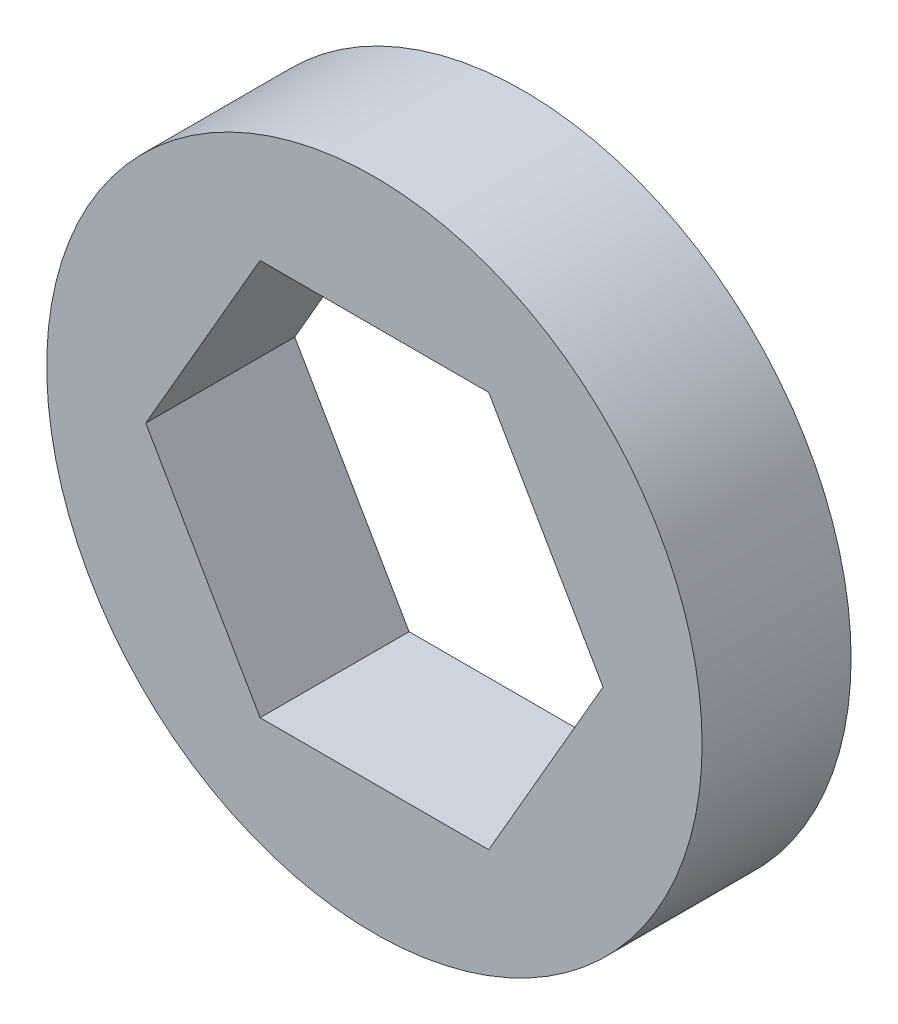
ISO-10303-21;
HEADER;
FILE_DESCRIPTION(('STEP AP214'),'2;1');
FILE_NAME('part.step','',(''),(''),'','','');
FILE_SCHEMA(('AUTOMOTIVE_DESIGN { 1 0 10303 214 1 1 1 1 }'));
ENDSEC;
DATA;
#1=APPLICATION_CONTEXT('core data for automotive mechanical design processes');
#2=APPLICATION_PROTOCOL_DEFINITION('international standard','automotive_design',2000,#1);
#3=PRODUCT_CONTEXT('',#1,'mechanical');
#4=PRODUCT('Part','Part','',(#3));
#5=PRODUCT_RELATED_PRODUCT_CATEGORY('part','',(#4));
#6=PRODUCT_DEFINITION_FORMATION('','',#4);
#7=PRODUCT_DEFINITION_CONTEXT('part definition',#1,'design');
#8=PRODUCT_DEFINITION('design','',#6,#7);
#9=PRODUCT_DEFINITION_SHAPE('','',#8);
#10=(LENGTH_UNIT() NAMED_UNIT(*) SI_UNIT(.MILLI.,.METRE.));
#11=(NAMED_UNIT(*) PLANE_ANGLE_UNIT() SI_UNIT($,.RADIAN.));
#12=(NAMED_UNIT(*) SI_UNIT($,.STERADIAN.) SOLID_ANGLE_UNIT());
#13=UNCERTAINTY_MEASURE_WITH_UNIT(LENGTH_MEASURE(1.E-05),#10,'distance_accuracy_value','');
#14=(GEOMETRIC_REPRESENTATION_CONTEXT(3) GLOBAL_UNCERTAINTY_ASSIGNED_CONTEXT((#13)) GLOBAL_UNIT_ASSIGNED_CONTEXT((#10,
#11,#12)) REPRESENTATION_CONTEXT('',''));
#15=CARTESIAN_POINT('',(0.,0.,0.));
#16=DIRECTION('',(0.,0.,1.));
#17=DIRECTION('',(1.,0.,0.));
#18=AXIS2_PLACEMENT_3D('',#15,#16,#17);
#19=CARTESIAN_POINT('',(0.,0.,4.7752));
#20=DIRECTION('',(0.,0.,1.));
#21=DIRECTION('',(1.,0.,0.));
#22=AXIS2_PLACEMENT_3D('',#19,#20,#21);
#23=PLANE('',#22);
#24=CARTESIAN_POINT('',(0.,0.,4.7752));
#25=DIRECTION('',(0.,0.,1.));
#26=DIRECTION('',(1.,0.,0.));
#27=AXIS2_PLACEMENT_3D('',#24,#25,#26);
#28=CIRCLE('',#27,10.5029);
#29=CARTESIAN_POINT('',(10.5029,0.,4.7752));
#30=VERTEX_POINT('',#29);
#31=EDGE_CURVE('E11',#30,#30,#28,.T.);
#32=ORIENTED_EDGE('',*,*,#31,.T.);
#33=EDGE_LOOP('',(#32));
#34=FACE_BOUND('',#33,.T.);
#35=DIRECTION('',(0.500000000000001,-0.866025403784438,0.));
#36=VECTOR('',#35,1.);
#37=CARTESIAN_POINT('',(-7.3279,0.,4.7752));
#38=LINE('',#37,#36);
#39=CARTESIAN_POINT('',(-7.3279,0.,4.7752));
#40=VERTEX_POINT('',#39);
#41=CARTESIAN_POINT('',(-3.66394999999998,-6.346147556392,4.7752));
#42=VERTEX_POINT('',#41);
#43=EDGE_CURVE('E102',#40,#42,#38,.T.);
#44=ORIENTED_EDGE('',*,*,#43,.F.);
#45=DIRECTION('',(-0.499999999999995,-0.866025403784442,0.));
#46=VECTOR('',#45,1.);
#47=CARTESIAN_POINT('',(-3.66395000000007,6.34614755639194,4.7752));
#48=LINE('',#47,#46);
#49=CARTESIAN_POINT('',(-3.66395000000007,6.34614755639194,4.7752));
#50=VERTEX_POINT('',#49);
#51=EDGE_CURVE('E93',#50,#40,#48,.T.);
#52=ORIENTED_EDGE('',*,*,#51,.F.);
#53=DIRECTION('',(-1.,0.,0.));
#54=VECTOR('',#53,1.);
#55=CARTESIAN_POINT('',(3.66394999999994,6.34614755639202,4.7752));
#56=LINE('',#55,#54);
#57=CARTESIAN_POINT('',(3.66394999999994,6.34614755639202,4.7752));
#58=VERTEX_POINT('',#57);
#59=EDGE_CURVE('E127',#58,#50,#56,.T.);
#60=ORIENTED_EDGE('',*,*,#59,.F.);
#61=DIRECTION('',(-0.500000000000007,0.866025403784435,0.));
#62=VECTOR('',#61,1.);
#63=CARTESIAN_POINT('',(7.3279,0.,4.7752));
#64=LINE('',#63,#62);
#65=CARTESIAN_POINT('',(7.3279,0.,4.7752));
#66=VERTEX_POINT('',#65);
#67=EDGE_CURVE('E124',#66,#58,#64,.T.);
#68=ORIENTED_EDGE('',*,*,#67,.F.);
#69=DIRECTION('',(0.499999999999995,0.866025403784442,0.));
#70=VECTOR('',#69,1.);
#71=CARTESIAN_POINT('',(3.66395000000003,-6.34614755639197,4.7752));
#72=LINE('',#71,#70);
#73=CARTESIAN_POINT('',(3.66395000000003,-6.34614755639197,4.7752));
#74=VERTEX_POINT('',#73);
#75=EDGE_CURVE('E119',#74,#66,#72,.T.);
#76=ORIENTED_EDGE('',*,*,#75,.F.);
#77=DIRECTION('',(1.,0.,0.));
#78=VECTOR('',#77,1.);
#79=CARTESIAN_POINT('',(-3.66394999999998,-6.346147556392,4.7752));
#80=LINE('',#79,#78);
#81=EDGE_CURVE('E115',#42,#74,#80,.T.);
#82=ORIENTED_EDGE('',*,*,#81,.F.);
#83=EDGE_LOOP('',(#44,#52,#60,#68,#76,#82));
#84=FACE_BOUND('',#83,.T.);
#85=ADVANCED_FACE('F39',(#34,#84),#23,.T.);
#86=CARTESIAN_POINT('',(0.,0.,0.));
#87=DIRECTION('',(0.,0.,1.));
#88=DIRECTION('',(1.,0.,0.));
#89=AXIS2_PLACEMENT_3D('',#86,#87,#88);
#90=PLANE('',#89);
#91=CARTESIAN_POINT('',(0.,0.,0.));
#92=DIRECTION('',(0.,0.,1.));
#93=DIRECTION('',(1.,0.,0.));
#94=AXIS2_PLACEMENT_3D('',#91,#92,#93);
#95=CIRCLE('',#94,10.5029);
#96=CARTESIAN_POINT('',(10.5029,0.,0.));
#97=VERTEX_POINT('',#96);
#98=EDGE_CURVE('E43',#97,#97,#95,.T.);
#99=ORIENTED_EDGE('',*,*,#98,.F.);
#100=EDGE_LOOP('',(#99));
#101=FACE_BOUND('',#100,.T.);
#102=DIRECTION('',(-0.499999999999995,-0.866025403784442,0.));
#103=VECTOR('',#102,1.);
#104=CARTESIAN_POINT('',(-3.66395000000007,6.34614755639194,0.));
#105=LINE('',#104,#103);
#106=CARTESIAN_POINT('',(-3.66395000000007,6.34614755639194,0.));
#107=VERTEX_POINT('',#106);
#108=CARTESIAN_POINT('',(-7.3279,0.,0.));
#109=VERTEX_POINT('',#108);
#110=EDGE_CURVE('E63',#107,#109,#105,.T.);
#111=ORIENTED_EDGE('',*,*,#110,.T.);
#112=DIRECTION('',(0.500000000000001,-0.866025403784438,0.));
#113=VECTOR('',#112,1.);
#114=CARTESIAN_POINT('',(-7.3279,0.,0.));
#115=LINE('',#114,#113);
#116=CARTESIAN_POINT('',(-3.66394999999998,-6.346147556392,0.));
#117=VERTEX_POINT('',#116);
#118=EDGE_CURVE('E109',#109,#117,#115,.T.);
#119=ORIENTED_EDGE('',*,*,#118,.T.);
#120=DIRECTION('',(1.,0.,0.));
#121=VECTOR('',#120,1.);
#122=CARTESIAN_POINT('',(-3.66394999999998,-6.346147556392,0.));
#123=LINE('',#122,#121);
#124=CARTESIAN_POINT('',(3.66395000000003,-6.34614755639197,0.));
#125=VERTEX_POINT('',#124);
#126=EDGE_CURVE('E134',#117,#125,#123,.T.);
#127=ORIENTED_EDGE('',*,*,#126,.T.);
#128=DIRECTION('',(0.499999999999995,0.866025403784442,0.));
#129=VECTOR('',#128,1.);
#130=CARTESIAN_POINT('',(3.66395000000003,-6.34614755639197,0.));
#131=LINE('',#130,#129);
#132=CARTESIAN_POINT('',(7.3279,0.,0.));
#133=VERTEX_POINT('',#132);
#134=EDGE_CURVE('E138',#125,#133,#131,.T.);
#135=ORIENTED_EDGE('',*,*,#134,.T.);
#136=DIRECTION('',(-0.500000000000007,0.866025403784435,0.));
#137=VECTOR('',#136,1.);
#138=CARTESIAN_POINT('',(7.3279,0.,0.));
#139=LINE('',#138,#137);
#140=CARTESIAN_POINT('',(3.66394999999994,6.34614755639202,0.));
#141=VERTEX_POINT('',#140);
#142=EDGE_CURVE('E142',#133,#141,#139,.T.);
#143=ORIENTED_EDGE('',*,*,#142,.T.);
#144=DIRECTION('',(-1.,0.,0.));
#145=VECTOR('',#144,1.);
#146=CARTESIAN_POINT('',(3.66394999999994,6.34614755639202,0.));
#147=LINE('',#146,#145);
#148=EDGE_CURVE('E103',#141,#107,#147,.T.);
#149=ORIENTED_EDGE('',*,*,#148,.T.);
#150=EDGE_LOOP('',(#111,#119,#127,#135,#143,#149));
#151=FACE_BOUND('',#150,.T.);
#152=ADVANCED_FACE('F166',(#101,#151),#90,.F.);
#153=CARTESIAN_POINT('',(0.,0.,4.7752));
#154=DIRECTION('',(0.,0.,-1.));
#155=DIRECTION('',(-1.,0.,0.));
#156=AXIS2_PLACEMENT_3D('',#153,#154,#155);
#157=CYLINDRICAL_SURFACE('',#156,10.5029);
#158=ORIENTED_EDGE('',*,*,#31,.F.);
#159=EDGE_LOOP('',(#158));
#160=FACE_BOUND('',#159,.T.);
#161=ORIENTED_EDGE('',*,*,#98,.T.);
#162=EDGE_LOOP('',(#161));
#163=FACE_BOUND('',#162,.T.);
#164=ADVANCED_FACE('F41',(#160,#163),#157,.T.);
#165=CARTESIAN_POINT('',(-3.66395000000007,6.34614755639194,4.7752));
#166=DIRECTION('',(0.866025403784442,-0.499999999999995,0.));
#167=DIRECTION('',(0.499999999999995,0.866025403784442,0.));
#168=AXIS2_PLACEMENT_3D('',#165,#166,#167);
#169=PLANE('',#168);
#170=ORIENTED_EDGE('',*,*,#110,.F.);
#171=DIRECTION('',(0.,0.,-1.));
#172=VECTOR('',#171,1.);
#173=CARTESIAN_POINT('',(-3.66395000000007,6.34614755639194,4.7752));
#174=LINE('',#173,#172);
#175=EDGE_CURVE('E97',#50,#107,#174,.T.);
#176=ORIENTED_EDGE('',*,*,#175,.F.);
#177=ORIENTED_EDGE('',*,*,#51,.T.);
#178=DIRECTION('',(0.,0.,-1.));
#179=VECTOR('',#178,1.);
#180=CARTESIAN_POINT('',(-7.3279,0.,4.7752));
#181=LINE('',#180,#179);
#182=EDGE_CURVE('E96',#40,#109,#181,.T.);
#183=ORIENTED_EDGE('',*,*,#182,.T.);
#184=EDGE_LOOP('',(#170,#176,#177,#183));
#185=FACE_BOUND('',#184,.T.);
#186=ADVANCED_FACE('F95',(#185),#169,.T.);
#187=CARTESIAN_POINT('',(-7.3279,0.,4.7752));
#188=DIRECTION('',(0.866025403784438,0.500000000000001,0.));
#189=DIRECTION('',(-0.500000000000001,0.866025403784438,0.));
#190=AXIS2_PLACEMENT_3D('',#187,#188,#189);
#191=PLANE('',#190);
#192=ORIENTED_EDGE('',*,*,#118,.F.);
#193=ORIENTED_EDGE('',*,*,#182,.F.);
#194=ORIENTED_EDGE('',*,*,#43,.T.);
#195=DIRECTION('',(0.,0.,-1.));
#196=VECTOR('',#195,1.);
#197=CARTESIAN_POINT('',(-3.66394999999998,-6.346147556392,4.7752));
#198=LINE('',#197,#196);
#199=EDGE_CURVE('E111',#42,#117,#198,.T.);
#200=ORIENTED_EDGE('',*,*,#199,.T.);
#201=EDGE_LOOP('',(#192,#193,#194,#200));
#202=FACE_BOUND('',#201,.T.);
#203=ADVANCED_FACE('F106',(#202),#191,.T.);
#204=CARTESIAN_POINT('',(-3.66394999999998,-6.346147556392,4.7752));
#205=DIRECTION('',(0.,1.,0.));
#206=DIRECTION('',(-1.,0.,0.));
#207=AXIS2_PLACEMENT_3D('',#204,#205,#206);
#208=PLANE('',#207);
#209=ORIENTED_EDGE('',*,*,#126,.F.);
#210=ORIENTED_EDGE('',*,*,#199,.F.);
#211=ORIENTED_EDGE('',*,*,#81,.T.);
#212=DIRECTION('',(0.,0.,-1.));
#213=VECTOR('',#212,1.);
#214=CARTESIAN_POINT('',(3.66395000000003,-6.34614755639197,4.7752));
#215=LINE('',#214,#213);
#216=EDGE_CURVE('E156',#74,#125,#215,.T.);
#217=ORIENTED_EDGE('',*,*,#216,.T.);
#218=EDGE_LOOP('',(#209,#210,#211,#217));
#219=FACE_BOUND('',#218,.T.);
#220=ADVANCED_FACE('F162',(#219),#208,.T.);
#221=CARTESIAN_POINT('',(3.66395000000003,-6.34614755639197,4.7752));
#222=DIRECTION('',(-0.866025403784442,0.499999999999995,0.));
#223=DIRECTION('',(-0.499999999999995,-0.866025403784442,0.));
#224=AXIS2_PLACEMENT_3D('',#221,#222,#223);
#225=PLANE('',#224);
#226=ORIENTED_EDGE('',*,*,#134,.F.);
#227=ORIENTED_EDGE('',*,*,#216,.F.);
#228=ORIENTED_EDGE('',*,*,#75,.T.);
#229=DIRECTION('',(0.,0.,-1.));
#230=VECTOR('',#229,1.);
#231=CARTESIAN_POINT('',(7.3279,0.,4.7752));
#232=LINE('',#231,#230);
#233=EDGE_CURVE('E153',#66,#133,#232,.T.);
#234=ORIENTED_EDGE('',*,*,#233,.T.);
#235=EDGE_LOOP('',(#226,#227,#228,#234));
#236=FACE_BOUND('',#235,.T.);
#237=ADVANCED_FACE('F174',(#236),#225,.T.);
#238=CARTESIAN_POINT('',(7.3279,0.,4.7752));
#239=DIRECTION('',(-0.866025403784435,-0.500000000000007,0.));
#240=DIRECTION('',(0.500000000000007,-0.866025403784435,0.));
#241=AXIS2_PLACEMENT_3D('',#238,#239,#240);
#242=PLANE('',#241);
#243=ORIENTED_EDGE('',*,*,#142,.F.);
#244=ORIENTED_EDGE('',*,*,#233,.F.);
#245=ORIENTED_EDGE('',*,*,#67,.T.);
#246=DIRECTION('',(0.,0.,-1.));
#247=VECTOR('',#246,1.);
#248=CARTESIAN_POINT('',(3.66394999999994,6.34614755639202,4.7752));
#249=LINE('',#248,#247);
#250=EDGE_CURVE('E55',#58,#141,#249,.T.);
#251=ORIENTED_EDGE('',*,*,#250,.T.);
#252=EDGE_LOOP('',(#243,#244,#245,#251));
#253=FACE_BOUND('',#252,.T.);
#254=ADVANCED_FACE('F172',(#253),#242,.T.);
#255=CARTESIAN_POINT('',(3.66394999999994,6.34614755639202,4.7752));
#256=DIRECTION('',(0.,-1.,0.));
#257=DIRECTION('',(1.,0.,0.));
#258=AXIS2_PLACEMENT_3D('',#255,#256,#257);
#259=PLANE('',#258);
#260=ORIENTED_EDGE('',*,*,#148,.F.);
#261=ORIENTED_EDGE('',*,*,#250,.F.);
#262=ORIENTED_EDGE('',*,*,#59,.T.);
#263=ORIENTED_EDGE('',*,*,#175,.T.);
#264=EDGE_LOOP('',(#260,#261,#262,#263));
#265=FACE_BOUND('',#264,.T.);
#266=ADVANCED_FACE('F168',(#265),#259,.T.);
#267=CLOSED_SHELL('',(#85,#152,#164,#186,#203,#220,#237,#254,#266));
#268=MANIFOLD_SOLID_BREP('B2',#267);
#269=ADVANCED_BREP_SHAPE_REPRESENTATION('',(#18,#268),#14);
#270=SHAPE_DEFINITION_REPRESENTATION(#9,#269);
ENDSEC;
END-ISO-10303-21;
